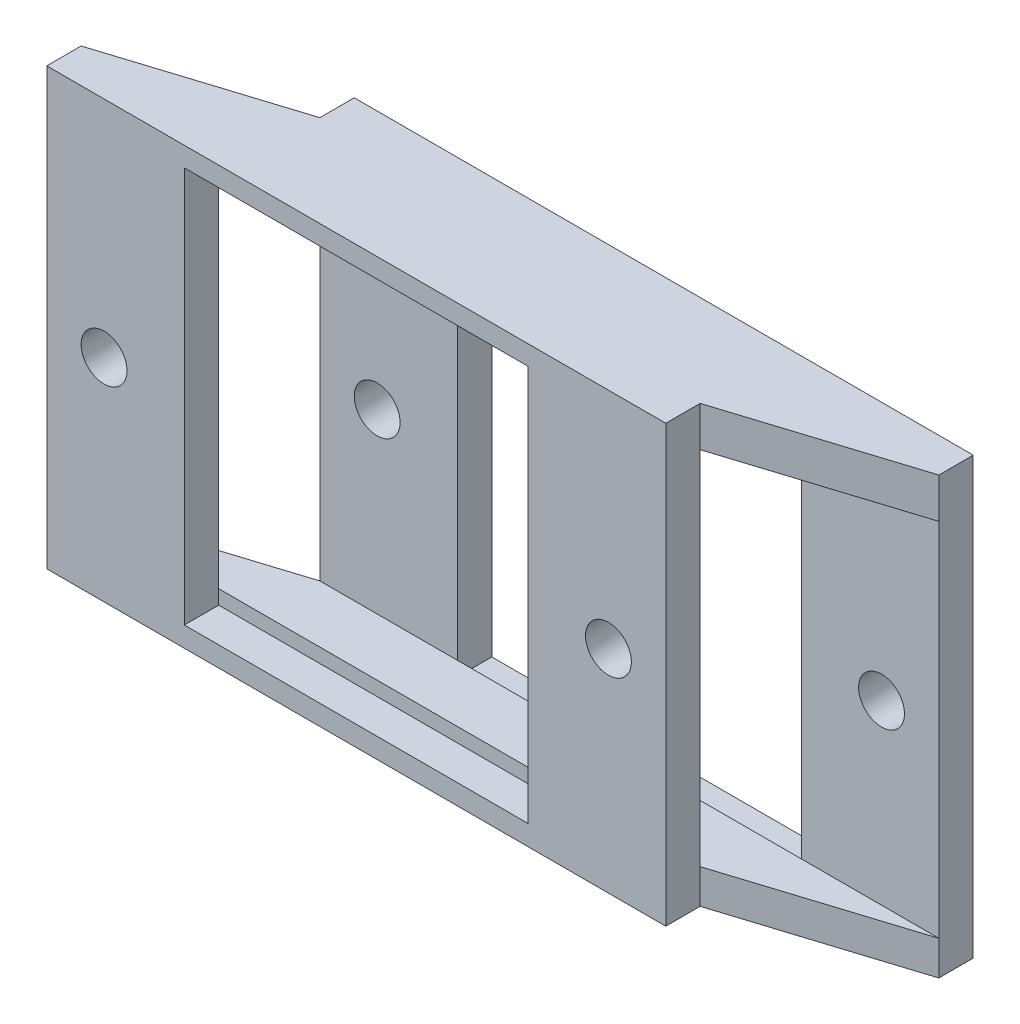
ISO-10303-21;
HEADER;
FILE_DESCRIPTION(('STEP AP214'),'2;1');
FILE_NAME('part.step','',(''),(''),'','','');
FILE_SCHEMA(('AUTOMOTIVE_DESIGN { 1 0 10303 214 1 1 1 1 }'));
ENDSEC;
DATA;
#1=APPLICATION_CONTEXT('core data for automotive mechanical design processes');
#2=APPLICATION_PROTOCOL_DEFINITION('international standard','automotive_design',2000,#1);
#3=PRODUCT_CONTEXT('',#1,'mechanical');
#4=PRODUCT('Part','Part','',(#3));
#5=PRODUCT_RELATED_PRODUCT_CATEGORY('part','',(#4));
#6=PRODUCT_DEFINITION_FORMATION('','',#4);
#7=PRODUCT_DEFINITION_CONTEXT('part definition',#1,'design');
#8=PRODUCT_DEFINITION('design','',#6,#7);
#9=PRODUCT_DEFINITION_SHAPE('','',#8);
#10=(LENGTH_UNIT() NAMED_UNIT(*) SI_UNIT(.MILLI.,.METRE.));
#11=(NAMED_UNIT(*) PLANE_ANGLE_UNIT() SI_UNIT($,.RADIAN.));
#12=(NAMED_UNIT(*) SI_UNIT($,.STERADIAN.) SOLID_ANGLE_UNIT());
#13=UNCERTAINTY_MEASURE_WITH_UNIT(LENGTH_MEASURE(1.E-05),#10,'distance_accuracy_value','');
#14=(GEOMETRIC_REPRESENTATION_CONTEXT(3) GLOBAL_UNCERTAINTY_ASSIGNED_CONTEXT((#13)) GLOBAL_UNIT_ASSIGNED_CONTEXT((#10,
#11,#12)) REPRESENTATION_CONTEXT('',''));
#15=CARTESIAN_POINT('',(0.,0.,0.));
#16=DIRECTION('',(0.,0.,1.));
#17=DIRECTION('',(1.,0.,0.));
#18=AXIS2_PLACEMENT_3D('',#15,#16,#17);
#19=CARTESIAN_POINT('',(0.,0.,0.));
#20=DIRECTION('',(0.,0.,1.));
#21=DIRECTION('',(1.,0.,0.));
#22=AXIS2_PLACEMENT_3D('',#19,#20,#21);
#23=PLANE('',#22);
#24=CARTESIAN_POINT('',(-30.4450352337086,8.52612807548933,0.));
#25=DIRECTION('',(0.,0.,-1.));
#26=DIRECTION('',(-1.,0.,0.));
#27=AXIS2_PLACEMENT_3D('',#24,#25,#26);
#28=CIRCLE('',#27,2.);
#29=CARTESIAN_POINT('',(-32.4450352337086,8.52612807548933,0.));
#30=VERTEX_POINT('',#29);
#31=EDGE_CURVE('E344',#30,#30,#28,.T.);
#32=ORIENTED_EDGE('',*,*,#31,.F.);
#33=EDGE_LOOP('',(#32));
#34=FACE_BOUND('',#33,.T.);
#35=DIRECTION('',(-1.,0.,0.));
#36=VECTOR('',#35,1.);
#37=CARTESIAN_POINT('',(18.5549647662914,-6.93387192451067,0.));
#38=LINE('',#37,#36);
#39=CARTESIAN_POINT('',(-23.4450352337086,-6.93387192451067,0.));
#40=VERTEX_POINT('',#39);
#41=CARTESIAN_POINT('',(-35.4450352337086,-6.93387192451066,0.));
#42=VERTEX_POINT('',#41);
#43=EDGE_CURVE('E68',#40,#42,#38,.T.);
#44=ORIENTED_EDGE('',*,*,#43,.T.);
#45=DIRECTION('',(0.,-1.,0.));
#46=VECTOR('',#45,1.);
#47=CARTESIAN_POINT('',(-35.4450352337086,28.0661280754893,0.));
#48=LINE('',#47,#46);
#49=CARTESIAN_POINT('',(-35.4450352337086,24.5661280754893,0.));
#50=VERTEX_POINT('',#49);
#51=EDGE_CURVE('E394',#50,#42,#48,.T.);
#52=ORIENTED_EDGE('',*,*,#51,.F.);
#53=DIRECTION('',(1.,0.,0.));
#54=VECTOR('',#53,1.);
#55=CARTESIAN_POINT('',(-35.4450352337086,24.5661280754893,0.));
#56=LINE('',#55,#54);
#57=CARTESIAN_POINT('',(-23.4450352337086,24.5661280754893,0.));
#58=VERTEX_POINT('',#57);
#59=EDGE_CURVE('E329',#50,#58,#56,.T.);
#60=ORIENTED_EDGE('',*,*,#59,.T.);
#61=DIRECTION('',(0.,-1.,0.));
#62=VECTOR('',#61,1.);
#63=CARTESIAN_POINT('',(-23.4450352337086,26.3627404436321,0.));
#64=LINE('',#63,#62);
#65=EDGE_CURVE('E361',#58,#40,#64,.T.);
#66=ORIENTED_EDGE('',*,*,#65,.T.);
#67=EDGE_LOOP('',(#44,#52,#60,#66));
#68=FACE_BOUND('',#67,.T.);
#69=ADVANCED_FACE('F41',(#34,#68),#23,.F.);
#70=CARTESIAN_POINT('',(13.5549647662914,8.52612807548933,0.));
#71=DIRECTION('',(0.,0.,-1.));
#72=DIRECTION('',(-1.,0.,0.));
#73=AXIS2_PLACEMENT_3D('',#70,#71,#72);
#74=CIRCLE('',#73,2.);
#75=CARTESIAN_POINT('',(11.5549647662914,8.52612807548933,0.));
#76=VERTEX_POINT('',#75);
#77=EDGE_CURVE('E349',#76,#76,#74,.T.);
#78=ORIENTED_EDGE('',*,*,#77,.F.);
#79=EDGE_LOOP('',(#78));
#80=FACE_BOUND('',#79,.T.);
#81=CARTESIAN_POINT('',(18.5549647662914,-6.93387192451066,0.));
#82=VERTEX_POINT('',#81);
#83=CARTESIAN_POINT('',(6.55496476629138,-6.93387192451067,0.));
#84=VERTEX_POINT('',#83);
#85=EDGE_CURVE('E432',#82,#84,#38,.T.);
#86=ORIENTED_EDGE('',*,*,#85,.T.);
#87=DIRECTION('',(0.,-1.,0.));
#88=VECTOR('',#87,1.);
#89=CARTESIAN_POINT('',(6.55496476629138,26.3627404436321,0.));
#90=LINE('',#89,#88);
#91=CARTESIAN_POINT('',(6.55496476629138,24.5661280754893,0.));
#92=VERTEX_POINT('',#91);
#93=EDGE_CURVE('E363',#92,#84,#90,.T.);
#94=ORIENTED_EDGE('',*,*,#93,.F.);
#95=CARTESIAN_POINT('',(18.5549647662914,24.5661280754893,0.));
#96=VERTEX_POINT('',#95);
#97=EDGE_CURVE('E50',#92,#96,#56,.T.);
#98=ORIENTED_EDGE('',*,*,#97,.T.);
#99=DIRECTION('',(0.,1.,0.));
#100=VECTOR('',#99,1.);
#101=CARTESIAN_POINT('',(18.5549647662914,28.0661280754893,0.));
#102=LINE('',#101,#100);
#103=EDGE_CURVE('E60',#82,#96,#102,.T.);
#104=ORIENTED_EDGE('',*,*,#103,.F.);
#105=EDGE_LOOP('',(#86,#94,#98,#104));
#106=FACE_BOUND('',#105,.T.);
#107=ADVANCED_FACE('F431',(#80,#106),#23,.F.);
#108=CARTESIAN_POINT('',(0.,0.,-5.));
#109=DIRECTION('',(0.,0.,-1.));
#110=DIRECTION('',(-1.,0.,0.));
#111=AXIS2_PLACEMENT_3D('',#108,#109,#110);
#112=PLANE('',#111);
#113=CARTESIAN_POINT('',(29.3795909959495,8.52612807548933,-5.));
#114=DIRECTION('',(0.,0.,-1.));
#115=DIRECTION('',(-1.,0.,0.));
#116=AXIS2_PLACEMENT_3D('',#113,#114,#115);
#117=CIRCLE('',#116,2.);
#118=CARTESIAN_POINT('',(27.3795909959495,8.52612807548933,-5.));
#119=VERTEX_POINT('',#118);
#120=EDGE_CURVE('E288',#119,#119,#117,.T.);
#121=ORIENTED_EDGE('',*,*,#120,.T.);
#122=EDGE_LOOP('',(#121));
#123=FACE_BOUND('',#122,.T.);
#124=DIRECTION('',(1.,0.,0.));
#125=VECTOR('',#124,1.);
#126=CARTESIAN_POINT('',(-19.6204090040505,-6.93387192451067,-5.));
#127=LINE('',#126,#125);
#128=CARTESIAN_POINT('',(22.3795909959495,-6.93387192451067,-5.));
#129=VERTEX_POINT('',#128);
#130=CARTESIAN_POINT('',(34.3795909959495,-6.93387192451067,-5.));
#131=VERTEX_POINT('',#130);
#132=EDGE_CURVE('E229',#129,#131,#127,.T.);
#133=ORIENTED_EDGE('',*,*,#132,.T.);
#134=DIRECTION('',(0.,-1.,0.));
#135=VECTOR('',#134,1.);
#136=CARTESIAN_POINT('',(34.3795909959495,28.0661280754893,-5.));
#137=LINE('',#136,#135);
#138=CARTESIAN_POINT('',(34.3795909959495,24.5661280754893,-5.));
#139=VERTEX_POINT('',#138);
#140=EDGE_CURVE('E294',#139,#131,#137,.T.);
#141=ORIENTED_EDGE('',*,*,#140,.F.);
#142=DIRECTION('',(-1.,0.,0.));
#143=VECTOR('',#142,1.);
#144=CARTESIAN_POINT('',(34.3795909959495,24.5661280754893,-5.));
#145=LINE('',#144,#143);
#146=CARTESIAN_POINT('',(22.3795909959495,24.5661280754893,-5.));
#147=VERTEX_POINT('',#146);
#148=EDGE_CURVE('E321',#139,#147,#145,.T.);
#149=ORIENTED_EDGE('',*,*,#148,.T.);
#150=DIRECTION('',(0.,-1.,0.));
#151=VECTOR('',#150,1.);
#152=CARTESIAN_POINT('',(22.3795909959495,26.3627404436321,-5.));
#153=LINE('',#152,#151);
#154=EDGE_CURVE('E259',#147,#129,#153,.T.);
#155=ORIENTED_EDGE('',*,*,#154,.T.);
#156=EDGE_LOOP('',(#133,#141,#149,#155));
#157=FACE_BOUND('',#156,.T.);
#158=ADVANCED_FACE('F519',(#123,#157),#112,.F.);
#159=CARTESIAN_POINT('',(-14.6204090040505,8.52612807548933,-5.));
#160=DIRECTION('',(0.,0.,-1.));
#161=DIRECTION('',(-1.,0.,0.));
#162=AXIS2_PLACEMENT_3D('',#159,#160,#161);
#163=CIRCLE('',#162,2.);
#164=CARTESIAN_POINT('',(-16.6204090040505,8.52612807548933,-5.));
#165=VERTEX_POINT('',#164);
#166=EDGE_CURVE('E284',#165,#165,#163,.T.);
#167=ORIENTED_EDGE('',*,*,#166,.T.);
#168=EDGE_LOOP('',(#167));
#169=FACE_BOUND('',#168,.T.);
#170=CARTESIAN_POINT('',(-19.6204090040505,-6.93387192451067,-5.));
#171=VERTEX_POINT('',#170);
#172=CARTESIAN_POINT('',(-7.62040900405047,-6.93387192451067,-5.));
#173=VERTEX_POINT('',#172);
#174=EDGE_CURVE('E218',#171,#173,#127,.T.);
#175=ORIENTED_EDGE('',*,*,#174,.T.);
#176=DIRECTION('',(0.,1.,0.));
#177=VECTOR('',#176,1.);
#178=CARTESIAN_POINT('',(-7.62040900405047,26.3627404436321,-5.));
#179=LINE('',#178,#177);
#180=CARTESIAN_POINT('',(-7.62040900405047,24.5661280754893,-5.));
#181=VERTEX_POINT('',#180);
#182=EDGE_CURVE('E53',#173,#181,#179,.T.);
#183=ORIENTED_EDGE('',*,*,#182,.T.);
#184=CARTESIAN_POINT('',(-19.6204090040505,24.5661280754893,-5.));
#185=VERTEX_POINT('',#184);
#186=EDGE_CURVE('E325',#181,#185,#145,.T.);
#187=ORIENTED_EDGE('',*,*,#186,.T.);
#188=DIRECTION('',(0.,1.,0.));
#189=VECTOR('',#188,1.);
#190=CARTESIAN_POINT('',(-19.6204090040505,28.0661280754893,-5.));
#191=LINE('',#190,#189);
#192=EDGE_CURVE('E220',#171,#185,#191,.T.);
#193=ORIENTED_EDGE('',*,*,#192,.F.);
#194=EDGE_LOOP('',(#175,#183,#187,#193));
#195=FACE_BOUND('',#194,.T.);
#196=ADVANCED_FACE('F219',(#169,#195),#112,.F.);
#197=CARTESIAN_POINT('',(34.3795909959495,24.5661280754893,-5.));
#198=DIRECTION('',(0.,0.,-1.));
#199=DIRECTION('',(-1.,0.,0.));
#200=AXIS2_PLACEMENT_3D('',#197,#198,#199);
#201=PLANE('',#200);
#202=DIRECTION('',(1.,0.,0.));
#203=VECTOR('',#202,1.);
#204=CARTESIAN_POINT('',(22.3795909959495,26.3627404436321,-5.));
#205=LINE('',#204,#203);
#206=CARTESIAN_POINT('',(-7.62040900405047,26.3627404436321,-5.));
#207=VERTEX_POINT('',#206);
#208=CARTESIAN_POINT('',(22.3795909959495,26.3627404436321,-5.));
#209=VERTEX_POINT('',#208);
#210=EDGE_CURVE('E234',#207,#209,#205,.T.);
#211=ORIENTED_EDGE('',*,*,#210,.T.);
#212=EDGE_CURVE('E270',#209,#147,#153,.T.);
#213=ORIENTED_EDGE('',*,*,#212,.T.);
#214=EDGE_CURVE('E324',#147,#181,#145,.T.);
#215=ORIENTED_EDGE('',*,*,#214,.T.);
#216=EDGE_CURVE('E11',#181,#207,#179,.T.);
#217=ORIENTED_EDGE('',*,*,#216,.T.);
#218=EDGE_LOOP('',(#211,#213,#215,#217));
#219=FACE_BOUND('',#218,.T.);
#220=ADVANCED_FACE('F528',(#219),#201,.T.);
#221=CARTESIAN_POINT('',(-35.4450352337086,28.0661280754893,3.));
#222=DIRECTION('',(1.,0.,0.));
#223=DIRECTION('',(0.,1.,0.));
#224=AXIS2_PLACEMENT_3D('',#221,#222,#223);
#225=PLANE('',#224);
#226=CARTESIAN_POINT('',(-35.4450352337086,28.0661280754893,0.));
#227=VERTEX_POINT('',#226);
#228=EDGE_CURVE('E406',#227,#50,#48,.T.);
#229=ORIENTED_EDGE('',*,*,#228,.T.);
#230=ORIENTED_EDGE('',*,*,#51,.T.);
#231=DIRECTION('',(0.,-1.,0.));
#232=VECTOR('',#231,1.);
#233=CARTESIAN_POINT('',(-35.4450352337086,-6.93387192451067,0.));
#234=LINE('',#233,#232);
#235=CARTESIAN_POINT('',(-35.4450352337086,-9.93387192451067,0.));
#236=VERTEX_POINT('',#235);
#237=EDGE_CURVE('E245',#42,#236,#234,.T.);
#238=ORIENTED_EDGE('',*,*,#237,.T.);
#239=DIRECTION('',(0.,0.,-1.));
#240=VECTOR('',#239,1.);
#241=CARTESIAN_POINT('',(-35.4450352337086,-9.93387192451067,3.));
#242=LINE('',#241,#240);
#243=CARTESIAN_POINT('',(-35.4450352337086,-9.93387192451067,3.));
#244=VERTEX_POINT('',#243);
#245=EDGE_CURVE('E45',#244,#236,#242,.T.);
#246=ORIENTED_EDGE('',*,*,#245,.F.);
#247=DIRECTION('',(0.,-1.,0.));
#248=VECTOR('',#247,1.);
#249=CARTESIAN_POINT('',(-35.4450352337086,28.0661280754893,3.));
#250=LINE('',#249,#248);
#251=CARTESIAN_POINT('',(-35.4450352337086,28.0661280754893,3.));
#252=VERTEX_POINT('',#251);
#253=EDGE_CURVE('E395',#252,#244,#250,.T.);
#254=ORIENTED_EDGE('',*,*,#253,.F.);
#255=DIRECTION('',(0.,0.,-1.));
#256=VECTOR('',#255,1.);
#257=CARTESIAN_POINT('',(-35.4450352337086,28.0661280754893,3.));
#258=LINE('',#257,#256);
#259=EDGE_CURVE('E405',#252,#227,#258,.T.);
#260=ORIENTED_EDGE('',*,*,#259,.T.);
#261=EDGE_LOOP('',(#229,#230,#238,#246,#254,#260));
#262=FACE_BOUND('',#261,.T.);
#263=ADVANCED_FACE('F43',(#262),#225,.F.);
#264=CARTESIAN_POINT('',(-35.4450352337086,-9.93387192451067,3.));
#265=DIRECTION('',(0.,1.,0.));
#266=DIRECTION('',(0.,0.,1.));
#267=AXIS2_PLACEMENT_3D('',#264,#265,#266);
#268=PLANE('',#267);
#269=ORIENTED_EDGE('',*,*,#245,.T.);
#270=DIRECTION('',(0.953535077123632,0.,-0.301282021857975));
#271=VECTOR('',#270,1.);
#272=CARTESIAN_POINT('',(-35.4450352337086,-9.93387192451067,0.));
#273=LINE('',#272,#271);
#274=CARTESIAN_POINT('',(-19.6204090040505,-9.93387192451067,-5.));
#275=VERTEX_POINT('',#274);
#276=EDGE_CURVE('E246',#236,#275,#273,.T.);
#277=ORIENTED_EDGE('',*,*,#276,.T.);
#278=DIRECTION('',(0.,0.,1.));
#279=VECTOR('',#278,1.);
#280=CARTESIAN_POINT('',(-19.6204090040505,-9.93387192451067,-8.));
#281=LINE('',#280,#279);
#282=CARTESIAN_POINT('',(-19.6204090040505,-9.93387192451067,-8.));
#283=VERTEX_POINT('',#282);
#284=EDGE_CURVE('E315',#283,#275,#281,.T.);
#285=ORIENTED_EDGE('',*,*,#284,.F.);
#286=DIRECTION('',(-1.,0.,0.));
#287=VECTOR('',#286,1.);
#288=CARTESIAN_POINT('',(34.3795909959495,-9.93387192451067,-8.));
#289=LINE('',#288,#287);
#290=CARTESIAN_POINT('',(34.3795909959495,-9.93387192451067,-8.));
#291=VERTEX_POINT('',#290);
#292=EDGE_CURVE('E300',#291,#283,#289,.T.);
#293=ORIENTED_EDGE('',*,*,#292,.F.);
#294=DIRECTION('',(0.,0.,1.));
#295=VECTOR('',#294,1.);
#296=CARTESIAN_POINT('',(34.3795909959495,-9.93387192451067,-8.));
#297=LINE('',#296,#295);
#298=CARTESIAN_POINT('',(34.3795909959495,-9.93387192451067,-5.));
#299=VERTEX_POINT('',#298);
#300=EDGE_CURVE('E317',#291,#299,#297,.T.);
#301=ORIENTED_EDGE('',*,*,#300,.T.);
#302=DIRECTION('',(-0.953535077123632,0.,0.301282021857976));
#303=VECTOR('',#302,1.);
#304=CARTESIAN_POINT('',(34.3795909959495,-9.93387192451067,-5.));
#305=LINE('',#304,#303);
#306=CARTESIAN_POINT('',(18.5549647662914,-9.93387192451067,0.));
#307=VERTEX_POINT('',#306);
#308=EDGE_CURVE('E249',#299,#307,#305,.T.);
#309=ORIENTED_EDGE('',*,*,#308,.T.);
#310=DIRECTION('',(0.,0.,-1.));
#311=VECTOR('',#310,1.);
#312=CARTESIAN_POINT('',(18.5549647662914,-9.93387192451067,3.));
#313=LINE('',#312,#311);
#314=CARTESIAN_POINT('',(18.5549647662914,-9.93387192451067,3.));
#315=VERTEX_POINT('',#314);
#316=EDGE_CURVE('E414',#315,#307,#313,.T.);
#317=ORIENTED_EDGE('',*,*,#316,.F.);
#318=DIRECTION('',(1.,0.,0.));
#319=VECTOR('',#318,1.);
#320=CARTESIAN_POINT('',(-35.4450352337086,-9.93387192451067,3.));
#321=LINE('',#320,#319);
#322=EDGE_CURVE('E398',#244,#315,#321,.T.);
#323=ORIENTED_EDGE('',*,*,#322,.F.);
#324=EDGE_LOOP('',(#269,#277,#285,#293,#301,#309,#317,#323));
#325=FACE_BOUND('',#324,.T.);
#326=ADVANCED_FACE('F481',(#325),#268,.F.);
#327=CARTESIAN_POINT('',(18.5549647662914,28.0661280754893,3.));
#328=DIRECTION('',(-1.,0.,0.));
#329=DIRECTION('',(0.,-1.,0.));
#330=AXIS2_PLACEMENT_3D('',#327,#328,#329);
#331=PLANE('',#330);
#332=EDGE_CURVE('E399',#307,#82,#102,.T.);
#333=ORIENTED_EDGE('',*,*,#332,.T.);
#334=ORIENTED_EDGE('',*,*,#103,.T.);
#335=DIRECTION('',(0.,1.,0.));
#336=VECTOR('',#335,1.);
#337=CARTESIAN_POINT('',(18.5549647662914,24.5661280754893,0.));
#338=LINE('',#337,#336);
#339=CARTESIAN_POINT('',(18.5549647662914,28.0661280754893,0.));
#340=VERTEX_POINT('',#339);
#341=EDGE_CURVE('E345',#96,#340,#338,.T.);
#342=ORIENTED_EDGE('',*,*,#341,.T.);
#343=DIRECTION('',(0.,0.,-1.));
#344=VECTOR('',#343,1.);
#345=CARTESIAN_POINT('',(18.5549647662914,28.0661280754893,3.));
#346=LINE('',#345,#344);
#347=CARTESIAN_POINT('',(18.5549647662914,28.0661280754893,3.));
#348=VERTEX_POINT('',#347);
#349=EDGE_CURVE('E412',#348,#340,#346,.T.);
#350=ORIENTED_EDGE('',*,*,#349,.F.);
#351=DIRECTION('',(0.,1.,0.));
#352=VECTOR('',#351,1.);
#353=CARTESIAN_POINT('',(18.5549647662914,28.0661280754893,3.));
#354=LINE('',#353,#352);
#355=EDGE_CURVE('E401',#315,#348,#354,.T.);
#356=ORIENTED_EDGE('',*,*,#355,.F.);
#357=ORIENTED_EDGE('',*,*,#316,.T.);
#358=EDGE_LOOP('',(#333,#334,#342,#350,#356,#357));
#359=FACE_BOUND('',#358,.T.);
#360=ADVANCED_FACE('F487',(#359),#331,.F.);
#361=CARTESIAN_POINT('',(-35.4450352337086,28.0661280754893,3.));
#362=DIRECTION('',(0.,-1.,0.));
#363=DIRECTION('',(0.,0.,-1.));
#364=AXIS2_PLACEMENT_3D('',#361,#362,#363);
#365=PLANE('',#364);
#366=ORIENTED_EDGE('',*,*,#349,.T.);
#367=DIRECTION('',(0.953535077123632,0.,-0.301282021857975));
#368=VECTOR('',#367,1.);
#369=CARTESIAN_POINT('',(18.5549647662914,28.0661280754893,0.));
#370=LINE('',#369,#368);
#371=CARTESIAN_POINT('',(34.3795909959495,28.0661280754893,-5.));
#372=VERTEX_POINT('',#371);
#373=EDGE_CURVE('E338',#340,#372,#370,.T.);
#374=ORIENTED_EDGE('',*,*,#373,.T.);
#375=DIRECTION('',(0.,0.,1.));
#376=VECTOR('',#375,1.);
#377=CARTESIAN_POINT('',(34.3795909959495,28.0661280754893,-8.));
#378=LINE('',#377,#376);
#379=CARTESIAN_POINT('',(34.3795909959495,28.0661280754893,-8.));
#380=VERTEX_POINT('',#379);
#381=EDGE_CURVE('E307',#380,#372,#378,.T.);
#382=ORIENTED_EDGE('',*,*,#381,.F.);
#383=DIRECTION('',(1.,0.,0.));
#384=VECTOR('',#383,1.);
#385=CARTESIAN_POINT('',(34.3795909959495,28.0661280754893,-8.));
#386=LINE('',#385,#384);
#387=CARTESIAN_POINT('',(-19.6204090040505,28.0661280754893,-8.));
#388=VERTEX_POINT('',#387);
#389=EDGE_CURVE('E305',#388,#380,#386,.T.);
#390=ORIENTED_EDGE('',*,*,#389,.F.);
#391=DIRECTION('',(0.,0.,1.));
#392=VECTOR('',#391,1.);
#393=CARTESIAN_POINT('',(-19.6204090040505,28.0661280754893,-8.));
#394=LINE('',#393,#392);
#395=CARTESIAN_POINT('',(-19.6204090040505,28.0661280754893,-5.));
#396=VERTEX_POINT('',#395);
#397=EDGE_CURVE('E312',#388,#396,#394,.T.);
#398=ORIENTED_EDGE('',*,*,#397,.T.);
#399=DIRECTION('',(-0.953535077123632,0.,0.301282021857976));
#400=VECTOR('',#399,1.);
#401=CARTESIAN_POINT('',(-19.6204090040505,28.0661280754893,-5.));
#402=LINE('',#401,#400);
#403=EDGE_CURVE('E320',#396,#227,#402,.T.);
#404=ORIENTED_EDGE('',*,*,#403,.T.);
#405=ORIENTED_EDGE('',*,*,#259,.F.);
#406=DIRECTION('',(-1.,0.,0.));
#407=VECTOR('',#406,1.);
#408=CARTESIAN_POINT('',(-35.4450352337086,28.0661280754893,3.));
#409=LINE('',#408,#407);
#410=EDGE_CURVE('E403',#348,#252,#409,.T.);
#411=ORIENTED_EDGE('',*,*,#410,.F.);
#412=EDGE_LOOP('',(#366,#374,#382,#390,#398,#404,#405,#411));
#413=FACE_BOUND('',#412,.T.);
#414=ADVANCED_FACE('F472',(#413),#365,.F.);
#415=CARTESIAN_POINT('',(0.,0.,3.));
#416=DIRECTION('',(0.,0.,1.));
#417=DIRECTION('',(1.,0.,0.));
#418=AXIS2_PLACEMENT_3D('',#415,#416,#417);
#419=PLANE('',#418);
#420=CARTESIAN_POINT('',(-30.4450352337086,8.52612807548933,3.));
#421=DIRECTION('',(0.,0.,1.));
#422=DIRECTION('',(1.,0.,0.));
#423=AXIS2_PLACEMENT_3D('',#420,#421,#422);
#424=CIRCLE('',#423,2.);
#425=CARTESIAN_POINT('',(-28.4450352337086,8.52612807548933,3.));
#426=VERTEX_POINT('',#425);
#427=EDGE_CURVE('E391',#426,#426,#424,.T.);
#428=ORIENTED_EDGE('',*,*,#427,.F.);
#429=EDGE_LOOP('',(#428));
#430=FACE_BOUND('',#429,.T.);
#431=CARTESIAN_POINT('',(13.5549647662914,8.52612807548933,3.));
#432=DIRECTION('',(0.,0.,1.));
#433=DIRECTION('',(1.,0.,0.));
#434=AXIS2_PLACEMENT_3D('',#431,#432,#433);
#435=CIRCLE('',#434,2.);
#436=CARTESIAN_POINT('',(15.5549647662914,8.52612807548933,3.));
#437=VERTEX_POINT('',#436);
#438=EDGE_CURVE('E388',#437,#437,#435,.T.);
#439=ORIENTED_EDGE('',*,*,#438,.F.);
#440=EDGE_LOOP('',(#439));
#441=FACE_BOUND('',#440,.T.);
#442=DIRECTION('',(1.,0.,0.));
#443=VECTOR('',#442,1.);
#444=CARTESIAN_POINT('',(0.,-8.17725955636787,3.));
#445=LINE('',#444,#443);
#446=CARTESIAN_POINT('',(-23.4450352337086,-8.17725955636787,3.));
#447=VERTEX_POINT('',#446);
#448=CARTESIAN_POINT('',(6.55496476629138,-8.17725955636787,3.));
#449=VERTEX_POINT('',#448);
#450=EDGE_CURVE('E386',#447,#449,#445,.T.);
#451=ORIENTED_EDGE('',*,*,#450,.F.);
#452=DIRECTION('',(0.,1.,0.));
#453=VECTOR('',#452,1.);
#454=CARTESIAN_POINT('',(-23.4450352337086,0.,3.));
#455=LINE('',#454,#453);
#456=CARTESIAN_POINT('',(-23.4450352337086,26.3627404436321,3.));
#457=VERTEX_POINT('',#456);
#458=EDGE_CURVE('E371',#447,#457,#455,.T.);
#459=ORIENTED_EDGE('',*,*,#458,.T.);
#460=DIRECTION('',(1.,0.,0.));
#461=VECTOR('',#460,1.);
#462=CARTESIAN_POINT('',(0.,26.3627404436321,3.));
#463=LINE('',#462,#461);
#464=CARTESIAN_POINT('',(6.55496476629138,26.3627404436321,3.));
#465=VERTEX_POINT('',#464);
#466=EDGE_CURVE('E381',#457,#465,#463,.T.);
#467=ORIENTED_EDGE('',*,*,#466,.T.);
#468=DIRECTION('',(0.,1.,0.));
#469=VECTOR('',#468,1.);
#470=CARTESIAN_POINT('',(6.55496476629138,0.,3.));
#471=LINE('',#470,#469);
#472=EDGE_CURVE('E384',#449,#465,#471,.T.);
#473=ORIENTED_EDGE('',*,*,#472,.F.);
#474=EDGE_LOOP('',(#451,#459,#467,#473));
#475=FACE_BOUND('',#474,.T.);
#476=ORIENTED_EDGE('',*,*,#253,.T.);
#477=ORIENTED_EDGE('',*,*,#322,.T.);
#478=ORIENTED_EDGE('',*,*,#355,.T.);
#479=ORIENTED_EDGE('',*,*,#410,.T.);
#480=EDGE_LOOP('',(#476,#477,#478,#479));
#481=FACE_BOUND('',#480,.T.);
#482=ADVANCED_FACE('F497',(#430,#441,#475,#481),#419,.T.);
#483=CARTESIAN_POINT('',(6.55496476629138,-8.17725955636787,34.54));
#484=DIRECTION('',(0.,-1.,0.));
#485=DIRECTION('',(0.,0.,-1.));
#486=AXIS2_PLACEMENT_3D('',#483,#484,#485);
#487=PLANE('',#486);
#488=ORIENTED_EDGE('',*,*,#450,.T.);
#489=DIRECTION('',(0.,0.,-1.));
#490=VECTOR('',#489,1.);
#491=CARTESIAN_POINT('',(6.55496476629138,-8.17725955636787,34.54));
#492=LINE('',#491,#490);
#493=CARTESIAN_POINT('',(6.55496476629138,-8.17725955636787,0.));
#494=VERTEX_POINT('',#493);
#495=EDGE_CURVE('E368',#449,#494,#492,.T.);
#496=ORIENTED_EDGE('',*,*,#495,.T.);
#497=DIRECTION('',(-1.,0.,0.));
#498=VECTOR('',#497,1.);
#499=CARTESIAN_POINT('',(6.55496476629138,-8.17725955636787,0.));
#500=LINE('',#499,#498);
#501=CARTESIAN_POINT('',(-23.4450352337086,-8.17725955636787,0.));
#502=VERTEX_POINT('',#501);
#503=EDGE_CURVE('E352',#494,#502,#500,.T.);
#504=ORIENTED_EDGE('',*,*,#503,.T.);
#505=DIRECTION('',(0.,0.,-1.));
#506=VECTOR('',#505,1.);
#507=CARTESIAN_POINT('',(-23.4450352337086,-8.17725955636787,34.54));
#508=LINE('',#507,#506);
#509=EDGE_CURVE('E367',#447,#502,#508,.T.);
#510=ORIENTED_EDGE('',*,*,#509,.F.);
#511=EDGE_LOOP('',(#488,#496,#504,#510));
#512=FACE_BOUND('',#511,.T.);
#513=ADVANCED_FACE('F499',(#512),#487,.F.);
#514=CARTESIAN_POINT('',(6.55496476629138,26.3627404436321,34.54));
#515=DIRECTION('',(1.,0.,0.));
#516=DIRECTION('',(0.,1.,0.));
#517=AXIS2_PLACEMENT_3D('',#514,#515,#516);
#518=PLANE('',#517);
#519=ORIENTED_EDGE('',*,*,#472,.T.);
#520=DIRECTION('',(0.,0.,-1.));
#521=VECTOR('',#520,1.);
#522=CARTESIAN_POINT('',(6.55496476629138,26.3627404436321,34.54));
#523=LINE('',#522,#521);
#524=CARTESIAN_POINT('',(6.55496476629138,26.3627404436321,0.));
#525=VERTEX_POINT('',#524);
#526=EDGE_CURVE('E372',#465,#525,#523,.T.);
#527=ORIENTED_EDGE('',*,*,#526,.T.);
#528=EDGE_CURVE('E364',#525,#92,#90,.T.);
#529=ORIENTED_EDGE('',*,*,#528,.T.);
#530=ORIENTED_EDGE('',*,*,#93,.T.);
#531=DIRECTION('',(0.,-1.,0.));
#532=VECTOR('',#531,1.);
#533=CARTESIAN_POINT('',(6.55496476629138,26.3627404436321,0.));
#534=LINE('',#533,#532);
#535=EDGE_CURVE('E257',#84,#494,#534,.T.);
#536=ORIENTED_EDGE('',*,*,#535,.T.);
#537=ORIENTED_EDGE('',*,*,#495,.F.);
#538=EDGE_LOOP('',(#519,#527,#529,#530,#536,#537));
#539=FACE_BOUND('',#538,.T.);
#540=ADVANCED_FACE('F435',(#539),#518,.F.);
#541=CARTESIAN_POINT('',(6.55496476629138,26.3627404436321,34.54));
#542=DIRECTION('',(0.,-1.,0.));
#543=DIRECTION('',(1.,0.,0.));
#544=AXIS2_PLACEMENT_3D('',#541,#542,#543);
#545=PLANE('',#544);
#546=DIRECTION('',(0.,0.,-1.));
#547=VECTOR('',#546,1.);
#548=CARTESIAN_POINT('',(-23.4450352337086,26.3627404436321,34.54));
#549=LINE('',#548,#547);
#550=CARTESIAN_POINT('',(-23.4450352337086,26.3627404436321,0.));
#551=VERTEX_POINT('',#550);
#552=EDGE_CURVE('E375',#457,#551,#549,.T.);
#553=ORIENTED_EDGE('',*,*,#552,.T.);
#554=DIRECTION('',(-1.,0.,0.));
#555=VECTOR('',#554,1.);
#556=CARTESIAN_POINT('',(6.55496476629138,26.3627404436321,0.));
#557=LINE('',#556,#555);
#558=EDGE_CURVE('E360',#525,#551,#557,.T.);
#559=ORIENTED_EDGE('',*,*,#558,.F.);
#560=ORIENTED_EDGE('',*,*,#526,.F.);
#561=ORIENTED_EDGE('',*,*,#466,.F.);
#562=EDGE_LOOP('',(#553,#559,#560,#561));
#563=FACE_BOUND('',#562,.T.);
#564=ADVANCED_FACE('F442',(#563),#545,.T.);
#565=CARTESIAN_POINT('',(-23.4450352337086,26.3627404436321,34.54));
#566=DIRECTION('',(1.,0.,0.));
#567=DIRECTION('',(0.,1.,0.));
#568=AXIS2_PLACEMENT_3D('',#565,#566,#567);
#569=PLANE('',#568);
#570=ORIENTED_EDGE('',*,*,#509,.T.);
#571=EDGE_CURVE('E357',#40,#502,#64,.T.);
#572=ORIENTED_EDGE('',*,*,#571,.F.);
#573=ORIENTED_EDGE('',*,*,#65,.F.);
#574=EDGE_CURVE('E358',#551,#58,#64,.T.);
#575=ORIENTED_EDGE('',*,*,#574,.F.);
#576=ORIENTED_EDGE('',*,*,#552,.F.);
#577=ORIENTED_EDGE('',*,*,#458,.F.);
#578=EDGE_LOOP('',(#570,#572,#573,#575,#576,#577));
#579=FACE_BOUND('',#578,.T.);
#580=ADVANCED_FACE('F445',(#579),#569,.T.);
#581=CARTESIAN_POINT('',(13.5549647662914,8.52612807548933,34.54));
#582=DIRECTION('',(0.,0.,-1.));
#583=DIRECTION('',(-1.,0.,0.));
#584=AXIS2_PLACEMENT_3D('',#581,#582,#583);
#585=CYLINDRICAL_SURFACE('',#584,2.);
#586=ORIENTED_EDGE('',*,*,#438,.T.);
#587=EDGE_LOOP('',(#586));
#588=FACE_BOUND('',#587,.T.);
#589=ORIENTED_EDGE('',*,*,#77,.T.);
#590=EDGE_LOOP('',(#589));
#591=FACE_BOUND('',#590,.T.);
#592=ADVANCED_FACE('F543',(#588,#591),#585,.F.);
#593=CARTESIAN_POINT('',(-30.4450352337086,8.52612807548933,34.54));
#594=DIRECTION('',(0.,0.,-1.));
#595=DIRECTION('',(-1.,0.,0.));
#596=AXIS2_PLACEMENT_3D('',#593,#594,#595);
#597=CYLINDRICAL_SURFACE('',#596,2.);
#598=ORIENTED_EDGE('',*,*,#427,.T.);
#599=EDGE_LOOP('',(#598));
#600=FACE_BOUND('',#599,.T.);
#601=ORIENTED_EDGE('',*,*,#31,.T.);
#602=EDGE_LOOP('',(#601));
#603=FACE_BOUND('',#602,.T.);
#604=ADVANCED_FACE('F545',(#600,#603),#597,.F.);
#605=CARTESIAN_POINT('',(18.5549647662914,24.5661280754893,0.));
#606=DIRECTION('',(0.301282021857976,0.,0.953535077123632));
#607=DIRECTION('',(0.953535077123632,0.,-0.301282021857976));
#608=AXIS2_PLACEMENT_3D('',#605,#606,#607);
#609=PLANE('',#608);
#610=ORIENTED_EDGE('',*,*,#373,.F.);
#611=ORIENTED_EDGE('',*,*,#341,.F.);
#612=DIRECTION('',(0.953535077123632,0.,-0.301282021857975));
#613=VECTOR('',#612,1.);
#614=CARTESIAN_POINT('',(18.5549647662914,24.5661280754893,0.));
#615=LINE('',#614,#613);
#616=EDGE_CURVE('E332',#96,#139,#615,.T.);
#617=ORIENTED_EDGE('',*,*,#616,.T.);
#618=DIRECTION('',(0.,1.,0.));
#619=VECTOR('',#618,1.);
#620=CARTESIAN_POINT('',(34.3795909959495,24.5661280754893,-5.));
#621=LINE('',#620,#619);
#622=EDGE_CURVE('E341',#139,#372,#621,.T.);
#623=ORIENTED_EDGE('',*,*,#622,.T.);
#624=EDGE_LOOP('',(#610,#611,#617,#623));
#625=FACE_BOUND('',#624,.T.);
#626=ADVANCED_FACE('F493',(#625),#609,.T.);
#627=CARTESIAN_POINT('',(-35.4450352337086,24.5661280754893,0.));
#628=DIRECTION('',(0.,0.,1.));
#629=DIRECTION('',(1.,0.,0.));
#630=AXIS2_PLACEMENT_3D('',#627,#628,#629);
#631=PLANE('',#630);
#632=ORIENTED_EDGE('',*,*,#558,.T.);
#633=ORIENTED_EDGE('',*,*,#574,.T.);
#634=EDGE_CURVE('E328',#58,#92,#56,.T.);
#635=ORIENTED_EDGE('',*,*,#634,.T.);
#636=ORIENTED_EDGE('',*,*,#528,.F.);
#637=EDGE_LOOP('',(#632,#633,#635,#636));
#638=FACE_BOUND('',#637,.T.);
#639=ADVANCED_FACE('F427',(#638),#631,.T.);
#640=CARTESIAN_POINT('',(-19.6204090040505,24.5661280754893,-5.));
#641=DIRECTION('',(-0.301282021857976,0.,-0.953535077123632));
#642=DIRECTION('',(-0.953535077123632,0.,0.301282021857976));
#643=AXIS2_PLACEMENT_3D('',#640,#641,#642);
#644=PLANE('',#643);
#645=ORIENTED_EDGE('',*,*,#403,.F.);
#646=DIRECTION('',(0.,1.,0.));
#647=VECTOR('',#646,1.);
#648=CARTESIAN_POINT('',(-19.6204090040505,24.5661280754893,-5.));
#649=LINE('',#648,#647);
#650=EDGE_CURVE('E335',#185,#396,#649,.T.);
#651=ORIENTED_EDGE('',*,*,#650,.F.);
#652=DIRECTION('',(-0.953535077123632,0.,0.301282021857976));
#653=VECTOR('',#652,1.);
#654=CARTESIAN_POINT('',(-19.6204090040505,24.5661280754893,-5.));
#655=LINE('',#654,#653);
#656=EDGE_CURVE('E323',#185,#50,#655,.T.);
#657=ORIENTED_EDGE('',*,*,#656,.T.);
#658=ORIENTED_EDGE('',*,*,#228,.F.);
#659=EDGE_LOOP('',(#645,#651,#657,#658));
#660=FACE_BOUND('',#659,.T.);
#661=ADVANCED_FACE('F465',(#660),#644,.T.);
#662=CARTESIAN_POINT('',(0.,24.5661280754893,0.));
#663=DIRECTION('',(0.,1.,0.));
#664=DIRECTION('',(0.,0.,1.));
#665=AXIS2_PLACEMENT_3D('',#662,#663,#664);
#666=PLANE('',#665);
#667=ORIENTED_EDGE('',*,*,#148,.F.);
#668=ORIENTED_EDGE('',*,*,#616,.F.);
#669=ORIENTED_EDGE('',*,*,#97,.F.);
#670=ORIENTED_EDGE('',*,*,#634,.F.);
#671=ORIENTED_EDGE('',*,*,#59,.F.);
#672=ORIENTED_EDGE('',*,*,#656,.F.);
#673=ORIENTED_EDGE('',*,*,#186,.F.);
#674=ORIENTED_EDGE('',*,*,#214,.F.);
#675=EDGE_LOOP('',(#667,#668,#669,#670,#671,#672,#673,#674));
#676=FACE_BOUND('',#675,.T.);
#677=ADVANCED_FACE('F461',(#676),#666,.F.);
#678=CARTESIAN_POINT('',(0.,0.,-8.));
#679=DIRECTION('',(0.,0.,-1.));
#680=DIRECTION('',(-1.,0.,0.));
#681=AXIS2_PLACEMENT_3D('',#678,#679,#680);
#682=PLANE('',#681);
#683=CARTESIAN_POINT('',(29.3795909959495,8.52612807548933,-8.));
#684=DIRECTION('',(0.,0.,-1.));
#685=DIRECTION('',(-1.,0.,0.));
#686=AXIS2_PLACEMENT_3D('',#683,#684,#685);
#687=CIRCLE('',#686,2.);
#688=CARTESIAN_POINT('',(27.3795909959495,8.52612807548933,-8.));
#689=VERTEX_POINT('',#688);
#690=EDGE_CURVE('E291',#689,#689,#687,.T.);
#691=ORIENTED_EDGE('',*,*,#690,.F.);
#692=EDGE_LOOP('',(#691));
#693=FACE_BOUND('',#692,.T.);
#694=DIRECTION('',(0.,-1.,0.));
#695=VECTOR('',#694,1.);
#696=CARTESIAN_POINT('',(34.3795909959495,28.0661280754893,-8.));
#697=LINE('',#696,#695);
#698=EDGE_CURVE('E297',#380,#291,#697,.T.);
#699=ORIENTED_EDGE('',*,*,#698,.T.);
#700=ORIENTED_EDGE('',*,*,#292,.T.);
#701=DIRECTION('',(0.,1.,0.));
#702=VECTOR('',#701,1.);
#703=CARTESIAN_POINT('',(-19.6204090040505,28.0661280754893,-8.));
#704=LINE('',#703,#702);
#705=EDGE_CURVE('E303',#283,#388,#704,.T.);
#706=ORIENTED_EDGE('',*,*,#705,.T.);
#707=ORIENTED_EDGE('',*,*,#389,.T.);
#708=EDGE_LOOP('',(#699,#700,#706,#707));
#709=FACE_BOUND('',#708,.T.);
#710=CARTESIAN_POINT('',(-14.6204090040505,8.52612807548933,-8.));
#711=DIRECTION('',(0.,0.,-1.));
#712=DIRECTION('',(-1.,0.,0.));
#713=AXIS2_PLACEMENT_3D('',#710,#711,#712);
#714=CIRCLE('',#713,2.);
#715=CARTESIAN_POINT('',(-16.6204090040505,8.52612807548933,-8.));
#716=VERTEX_POINT('',#715);
#717=EDGE_CURVE('E285',#716,#716,#714,.T.);
#718=ORIENTED_EDGE('',*,*,#717,.F.);
#719=EDGE_LOOP('',(#718));
#720=FACE_BOUND('',#719,.T.);
#721=DIRECTION('',(-1.,0.,0.));
#722=VECTOR('',#721,1.);
#723=CARTESIAN_POINT('',(22.3795909959495,-8.17725955636787,-8.));
#724=LINE('',#723,#722);
#725=CARTESIAN_POINT('',(22.3795909959495,-8.17725955636787,-8.));
#726=VERTEX_POINT('',#725);
#727=CARTESIAN_POINT('',(-7.62040900405047,-8.17725955636787,-8.));
#728=VERTEX_POINT('',#727);
#729=EDGE_CURVE('E262',#726,#728,#724,.T.);
#730=ORIENTED_EDGE('',*,*,#729,.F.);
#731=DIRECTION('',(0.,-1.,0.));
#732=VECTOR('',#731,1.);
#733=CARTESIAN_POINT('',(22.3795909959495,26.3627404436321,-8.));
#734=LINE('',#733,#732);
#735=CARTESIAN_POINT('',(22.3795909959495,26.3627404436321,-8.));
#736=VERTEX_POINT('',#735);
#737=EDGE_CURVE('E260',#736,#726,#734,.T.);
#738=ORIENTED_EDGE('',*,*,#737,.F.);
#739=DIRECTION('',(1.,0.,0.));
#740=VECTOR('',#739,1.);
#741=CARTESIAN_POINT('',(22.3795909959495,26.3627404436321,-8.));
#742=LINE('',#741,#740);
#743=CARTESIAN_POINT('',(-7.62040900405047,26.3627404436321,-8.));
#744=VERTEX_POINT('',#743);
#745=EDGE_CURVE('E267',#744,#736,#742,.T.);
#746=ORIENTED_EDGE('',*,*,#745,.F.);
#747=DIRECTION('',(0.,1.,0.));
#748=VECTOR('',#747,1.);
#749=CARTESIAN_POINT('',(-7.62040900405047,26.3627404436321,-8.));
#750=LINE('',#749,#748);
#751=EDGE_CURVE('E264',#728,#744,#750,.T.);
#752=ORIENTED_EDGE('',*,*,#751,.F.);
#753=EDGE_LOOP('',(#730,#738,#746,#752));
#754=FACE_BOUND('',#753,.T.);
#755=ADVANCED_FACE('F477',(#693,#709,#720,#754),#682,.T.);
#756=CARTESIAN_POINT('',(34.3795909959495,28.0661280754893,-8.));
#757=DIRECTION('',(-1.,0.,0.));
#758=DIRECTION('',(0.,0.,1.));
#759=AXIS2_PLACEMENT_3D('',#756,#757,#758);
#760=PLANE('',#759);
#761=ORIENTED_EDGE('',*,*,#622,.F.);
#762=ORIENTED_EDGE('',*,*,#140,.T.);
#763=DIRECTION('',(0.,-1.,0.));
#764=VECTOR('',#763,1.);
#765=CARTESIAN_POINT('',(34.3795909959495,-6.93387192451067,-5.));
#766=LINE('',#765,#764);
#767=EDGE_CURVE('E252',#131,#299,#766,.T.);
#768=ORIENTED_EDGE('',*,*,#767,.T.);
#769=ORIENTED_EDGE('',*,*,#300,.F.);
#770=ORIENTED_EDGE('',*,*,#698,.F.);
#771=ORIENTED_EDGE('',*,*,#381,.T.);
#772=EDGE_LOOP('',(#761,#762,#768,#769,#770,#771));
#773=FACE_BOUND('',#772,.T.);
#774=ADVANCED_FACE('F564',(#773),#760,.F.);
#775=CARTESIAN_POINT('',(-19.6204090040505,28.0661280754893,-8.));
#776=DIRECTION('',(1.,0.,0.));
#777=DIRECTION('',(0.,0.,-1.));
#778=AXIS2_PLACEMENT_3D('',#775,#776,#777);
#779=PLANE('',#778);
#780=EDGE_CURVE('E301',#275,#171,#191,.T.);
#781=ORIENTED_EDGE('',*,*,#780,.T.);
#782=ORIENTED_EDGE('',*,*,#192,.T.);
#783=ORIENTED_EDGE('',*,*,#650,.T.);
#784=ORIENTED_EDGE('',*,*,#397,.F.);
#785=ORIENTED_EDGE('',*,*,#705,.F.);
#786=ORIENTED_EDGE('',*,*,#284,.T.);
#787=EDGE_LOOP('',(#781,#782,#783,#784,#785,#786));
#788=FACE_BOUND('',#787,.T.);
#789=ADVANCED_FACE('F468',(#788),#779,.F.);
#790=CARTESIAN_POINT('',(29.3795909959495,8.52612807548933,-8.));
#791=DIRECTION('',(0.,0.,1.));
#792=DIRECTION('',(1.,0.,0.));
#793=AXIS2_PLACEMENT_3D('',#790,#791,#792);
#794=CYLINDRICAL_SURFACE('',#793,2.);
#795=ORIENTED_EDGE('',*,*,#690,.T.);
#796=EDGE_LOOP('',(#795));
#797=FACE_BOUND('',#796,.T.);
#798=ORIENTED_EDGE('',*,*,#120,.F.);
#799=EDGE_LOOP('',(#798));
#800=FACE_BOUND('',#799,.T.);
#801=ADVANCED_FACE('F575',(#797,#800),#794,.F.);
#802=CARTESIAN_POINT('',(-14.6204090040505,8.52612807548933,-8.));
#803=DIRECTION('',(0.,0.,1.));
#804=DIRECTION('',(1.,0.,0.));
#805=AXIS2_PLACEMENT_3D('',#802,#803,#804);
#806=CYLINDRICAL_SURFACE('',#805,2.);
#807=ORIENTED_EDGE('',*,*,#717,.T.);
#808=EDGE_LOOP('',(#807));
#809=FACE_BOUND('',#808,.T.);
#810=ORIENTED_EDGE('',*,*,#166,.F.);
#811=EDGE_LOOP('',(#810));
#812=FACE_BOUND('',#811,.T.);
#813=ADVANCED_FACE('F585',(#809,#812),#806,.F.);
#814=CARTESIAN_POINT('',(22.3795909959495,26.3627404436321,-8.));
#815=DIRECTION('',(-1.,0.,0.));
#816=DIRECTION('',(0.,0.,1.));
#817=AXIS2_PLACEMENT_3D('',#814,#815,#816);
#818=PLANE('',#817);
#819=ORIENTED_EDGE('',*,*,#212,.F.);
#820=DIRECTION('',(0.,0.,1.));
#821=VECTOR('',#820,1.);
#822=CARTESIAN_POINT('',(22.3795909959495,26.3627404436321,-8.));
#823=LINE('',#822,#821);
#824=EDGE_CURVE('E269',#736,#209,#823,.T.);
#825=ORIENTED_EDGE('',*,*,#824,.F.);
#826=ORIENTED_EDGE('',*,*,#737,.T.);
#827=DIRECTION('',(0.,0.,1.));
#828=VECTOR('',#827,1.);
#829=CARTESIAN_POINT('',(22.3795909959495,-8.17725955636787,-8.));
#830=LINE('',#829,#828);
#831=CARTESIAN_POINT('',(22.3795909959495,-8.17725955636787,-5.));
#832=VERTEX_POINT('',#831);
#833=EDGE_CURVE('E281',#726,#832,#830,.T.);
#834=ORIENTED_EDGE('',*,*,#833,.T.);
#835=DIRECTION('',(0.,-1.,0.));
#836=VECTOR('',#835,1.);
#837=CARTESIAN_POINT('',(22.3795909959495,26.3627404436321,-5.));
#838=LINE('',#837,#836);
#839=EDGE_CURVE('E254',#129,#832,#838,.T.);
#840=ORIENTED_EDGE('',*,*,#839,.F.);
#841=ORIENTED_EDGE('',*,*,#154,.F.);
#842=EDGE_LOOP('',(#819,#825,#826,#834,#840,#841));
#843=FACE_BOUND('',#842,.T.);
#844=ADVANCED_FACE('F580',(#843),#818,.T.);
#845=CARTESIAN_POINT('',(22.3795909959495,-8.17725955636787,-8.));
#846=DIRECTION('',(0.,1.,0.));
#847=DIRECTION('',(0.,0.,1.));
#848=AXIS2_PLACEMENT_3D('',#845,#846,#847);
#849=PLANE('',#848);
#850=DIRECTION('',(-1.,0.,0.));
#851=VECTOR('',#850,1.);
#852=CARTESIAN_POINT('',(22.3795909959495,-8.17725955636787,-5.));
#853=LINE('',#852,#851);
#854=CARTESIAN_POINT('',(-7.62040900405047,-8.17725955636787,-5.));
#855=VERTEX_POINT('',#854);
#856=EDGE_CURVE('E216',#832,#855,#853,.T.);
#857=ORIENTED_EDGE('',*,*,#856,.F.);
#858=ORIENTED_EDGE('',*,*,#833,.F.);
#859=ORIENTED_EDGE('',*,*,#729,.T.);
#860=DIRECTION('',(0.,0.,1.));
#861=VECTOR('',#860,1.);
#862=CARTESIAN_POINT('',(-7.62040900405047,-8.17725955636787,-8.));
#863=LINE('',#862,#861);
#864=EDGE_CURVE('E279',#728,#855,#863,.T.);
#865=ORIENTED_EDGE('',*,*,#864,.T.);
#866=EDGE_LOOP('',(#857,#858,#859,#865));
#867=FACE_BOUND('',#866,.T.);
#868=ADVANCED_FACE('F584',(#867),#849,.T.);
#869=CARTESIAN_POINT('',(-7.62040900405047,26.3627404436321,-8.));
#870=DIRECTION('',(1.,0.,0.));
#871=DIRECTION('',(0.,0.,-1.));
#872=AXIS2_PLACEMENT_3D('',#869,#870,#871);
#873=PLANE('',#872);
#874=EDGE_CURVE('E52',#855,#173,#179,.T.);
#875=ORIENTED_EDGE('',*,*,#874,.F.);
#876=ORIENTED_EDGE('',*,*,#864,.F.);
#877=ORIENTED_EDGE('',*,*,#751,.T.);
#878=DIRECTION('',(0.,0.,1.));
#879=VECTOR('',#878,1.);
#880=CARTESIAN_POINT('',(-7.62040900405047,26.3627404436321,-8.));
#881=LINE('',#880,#879);
#882=EDGE_CURVE('E277',#744,#207,#881,.T.);
#883=ORIENTED_EDGE('',*,*,#882,.T.);
#884=ORIENTED_EDGE('',*,*,#216,.F.);
#885=ORIENTED_EDGE('',*,*,#182,.F.);
#886=EDGE_LOOP('',(#875,#876,#877,#883,#884,#885));
#887=FACE_BOUND('',#886,.T.);
#888=ADVANCED_FACE('F209',(#887),#873,.T.);
#889=CARTESIAN_POINT('',(22.3795909959495,26.3627404436321,-8.));
#890=DIRECTION('',(0.,-1.,0.));
#891=DIRECTION('',(0.,0.,-1.));
#892=AXIS2_PLACEMENT_3D('',#889,#890,#891);
#893=PLANE('',#892);
#894=ORIENTED_EDGE('',*,*,#210,.F.);
#895=ORIENTED_EDGE('',*,*,#882,.F.);
#896=ORIENTED_EDGE('',*,*,#745,.T.);
#897=ORIENTED_EDGE('',*,*,#824,.T.);
#898=EDGE_LOOP('',(#894,#895,#896,#897));
#899=FACE_BOUND('',#898,.T.);
#900=ADVANCED_FACE('F601',(#899),#893,.T.);
#901=CARTESIAN_POINT('',(18.5549647662914,-6.93387192451067,0.));
#902=DIRECTION('',(0.,0.,1.));
#903=DIRECTION('',(1.,0.,0.));
#904=AXIS2_PLACEMENT_3D('',#901,#902,#903);
#905=PLANE('',#904);
#906=ORIENTED_EDGE('',*,*,#535,.F.);
#907=EDGE_CURVE('E452',#84,#40,#38,.T.);
#908=ORIENTED_EDGE('',*,*,#907,.T.);
#909=ORIENTED_EDGE('',*,*,#571,.T.);
#910=ORIENTED_EDGE('',*,*,#503,.F.);
#911=EDGE_LOOP('',(#906,#908,#909,#910));
#912=FACE_BOUND('',#911,.T.);
#913=ADVANCED_FACE('F450',(#912),#905,.T.);
#914=CARTESIAN_POINT('',(34.3795909959495,-6.93387192451067,-5.));
#915=DIRECTION('',(0.301282021857976,0.,0.953535077123632));
#916=DIRECTION('',(0.953535077123632,0.,-0.301282021857976));
#917=AXIS2_PLACEMENT_3D('',#914,#915,#916);
#918=PLANE('',#917);
#919=ORIENTED_EDGE('',*,*,#308,.F.);
#920=ORIENTED_EDGE('',*,*,#767,.F.);
#921=DIRECTION('',(-0.953535077123632,0.,0.301282021857976));
#922=VECTOR('',#921,1.);
#923=CARTESIAN_POINT('',(34.3795909959495,-6.93387192451067,-5.));
#924=LINE('',#923,#922);
#925=EDGE_CURVE('E226',#131,#82,#924,.T.);
#926=ORIENTED_EDGE('',*,*,#925,.T.);
#927=ORIENTED_EDGE('',*,*,#332,.F.);
#928=EDGE_LOOP('',(#919,#920,#926,#927));
#929=FACE_BOUND('',#928,.T.);
#930=ADVANCED_FACE('F486',(#929),#918,.T.);
#931=CARTESIAN_POINT('',(-19.6204090040505,-6.93387192451067,-5.));
#932=DIRECTION('',(0.,0.,-1.));
#933=DIRECTION('',(-1.,0.,0.));
#934=AXIS2_PLACEMENT_3D('',#931,#932,#933);
#935=PLANE('',#934);
#936=EDGE_CURVE('E227',#173,#129,#127,.T.);
#937=ORIENTED_EDGE('',*,*,#936,.T.);
#938=ORIENTED_EDGE('',*,*,#839,.T.);
#939=ORIENTED_EDGE('',*,*,#856,.T.);
#940=ORIENTED_EDGE('',*,*,#874,.T.);
#941=EDGE_LOOP('',(#937,#938,#939,#940));
#942=FACE_BOUND('',#941,.T.);
#943=ADVANCED_FACE('F232',(#942),#935,.T.);
#944=CARTESIAN_POINT('',(-35.4450352337086,-6.93387192451067,0.));
#945=DIRECTION('',(-0.301282021857976,0.,-0.953535077123632));
#946=DIRECTION('',(-0.953535077123632,0.,0.301282021857976));
#947=AXIS2_PLACEMENT_3D('',#944,#945,#946);
#948=PLANE('',#947);
#949=ORIENTED_EDGE('',*,*,#276,.F.);
#950=ORIENTED_EDGE('',*,*,#237,.F.);
#951=DIRECTION('',(0.953535077123632,0.,-0.301282021857975));
#952=VECTOR('',#951,1.);
#953=CARTESIAN_POINT('',(-35.4450352337086,-6.93387192451067,0.));
#954=LINE('',#953,#952);
#955=EDGE_CURVE('E239',#42,#171,#954,.T.);
#956=ORIENTED_EDGE('',*,*,#955,.T.);
#957=ORIENTED_EDGE('',*,*,#780,.F.);
#958=EDGE_LOOP('',(#949,#950,#956,#957));
#959=FACE_BOUND('',#958,.T.);
#960=ADVANCED_FACE('F456',(#959),#948,.T.);
#961=CARTESIAN_POINT('',(0.,-6.93387192451066,0.));
#962=DIRECTION('',(0.,-1.,0.));
#963=DIRECTION('',(0.,0.,-1.));
#964=AXIS2_PLACEMENT_3D('',#961,#962,#963);
#965=PLANE('',#964);
#966=ORIENTED_EDGE('',*,*,#85,.F.);
#967=ORIENTED_EDGE('',*,*,#925,.F.);
#968=ORIENTED_EDGE('',*,*,#132,.F.);
#969=ORIENTED_EDGE('',*,*,#936,.F.);
#970=ORIENTED_EDGE('',*,*,#174,.F.);
#971=ORIENTED_EDGE('',*,*,#955,.F.);
#972=ORIENTED_EDGE('',*,*,#43,.F.);
#973=ORIENTED_EDGE('',*,*,#907,.F.);
#974=EDGE_LOOP('',(#966,#967,#968,#969,#970,#971,#972,#973));
#975=FACE_BOUND('',#974,.T.);
#976=ADVANCED_FACE('F237',(#975),#965,.F.);
#977=CLOSED_SHELL('',(#69,#107,#158,#196,#220,#263,#326,#360,#414,#482,#513,#540,#564,#580,#592,
#604,#626,#639,#661,#677,#755,#774,#789,#801,#813,#844,#868,#888,#900,#913,#930,#943,#960,#976));
#978=MANIFOLD_SOLID_BREP('B2',#977);
#979=ADVANCED_BREP_SHAPE_REPRESENTATION('',(#18,#978),#14);
#980=SHAPE_DEFINITION_REPRESENTATION(#9,#979);
ENDSEC;
END-ISO-10303-21;
